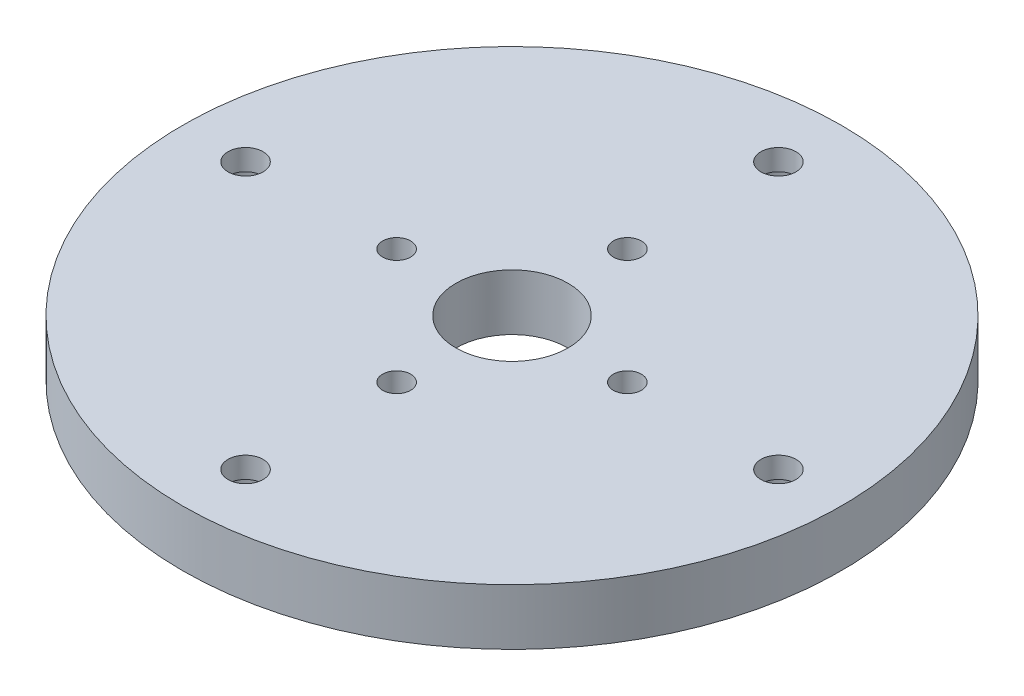
ISO-10303-21;
HEADER;
FILE_DESCRIPTION(('STEP AP214'),'2;1');
FILE_NAME('part.step','',(''),(''),'','','');
FILE_SCHEMA(('AUTOMOTIVE_DESIGN { 1 0 10303 214 1 1 1 1 }'));
ENDSEC;
DATA;
#1=APPLICATION_CONTEXT('core data for automotive mechanical design processes');
#2=APPLICATION_PROTOCOL_DEFINITION('international standard','automotive_design',2000,#1);
#3=PRODUCT_CONTEXT('',#1,'mechanical');
#4=PRODUCT('Part','Part','',(#3));
#5=PRODUCT_RELATED_PRODUCT_CATEGORY('part','',(#4));
#6=PRODUCT_DEFINITION_FORMATION('','',#4);
#7=PRODUCT_DEFINITION_CONTEXT('part definition',#1,'design');
#8=PRODUCT_DEFINITION('design','',#6,#7);
#9=PRODUCT_DEFINITION_SHAPE('','',#8);
#10=(LENGTH_UNIT() NAMED_UNIT(*) SI_UNIT(.MILLI.,.METRE.));
#11=(NAMED_UNIT(*) PLANE_ANGLE_UNIT() SI_UNIT($,.RADIAN.));
#12=(NAMED_UNIT(*) SI_UNIT($,.STERADIAN.) SOLID_ANGLE_UNIT());
#13=UNCERTAINTY_MEASURE_WITH_UNIT(LENGTH_MEASURE(1.E-05),#10,'distance_accuracy_value','');
#14=(GEOMETRIC_REPRESENTATION_CONTEXT(3) GLOBAL_UNCERTAINTY_ASSIGNED_CONTEXT((#13)) GLOBAL_UNIT_ASSIGNED_CONTEXT((#10,
#11,#12)) REPRESENTATION_CONTEXT('',''));
#15=CARTESIAN_POINT('',(0.,0.,0.));
#16=DIRECTION('',(0.,0.,1.));
#17=DIRECTION('',(1.,0.,0.));
#18=AXIS2_PLACEMENT_3D('',#15,#16,#17);
#19=CARTESIAN_POINT('',(-18.9999999999991,0.,7.01970902328204E-13));
#20=DIRECTION('',(0.,1.,0.));
#21=DIRECTION('',(0.,0.,1.));
#22=AXIS2_PLACEMENT_3D('',#19,#20,#21);
#23=CYLINDRICAL_SURFACE('',#22,1.25000000000112);
#24=CARTESIAN_POINT('',(-18.9999999999991,4.,7.01970902328204E-13));
#25=DIRECTION('',(0.,1.,0.));
#26=DIRECTION('',(0.,0.,1.));
#27=AXIS2_PLACEMENT_3D('',#24,#25,#26);
#28=CIRCLE('',#27,1.25000000000112);
#29=CARTESIAN_POINT('',(-18.9999999999991,4.,1.25000000000182));
#30=VERTEX_POINT('',#29);
#31=EDGE_CURVE('E97',#30,#30,#28,.T.);
#32=ORIENTED_EDGE('',*,*,#31,.T.);
#33=EDGE_LOOP('',(#32));
#34=FACE_BOUND('',#33,.T.);
#35=CARTESIAN_POINT('',(-18.9999999999991,2.5,7.01970902328204E-13));
#36=DIRECTION('',(0.,-1.,0.));
#37=DIRECTION('',(0.,0.,-1.));
#38=AXIS2_PLACEMENT_3D('',#35,#36,#37);
#39=CIRCLE('',#38,1.25000000000112);
#40=CARTESIAN_POINT('',(-18.9999999999991,2.5,-1.25000000000041));
#41=VERTEX_POINT('',#40);
#42=EDGE_CURVE('E47',#41,#41,#39,.F.);
#43=ORIENTED_EDGE('',*,*,#42,.F.);
#44=EDGE_LOOP('',(#43));
#45=FACE_BOUND('',#44,.T.);
#46=ADVANCED_FACE('F43',(#34,#45),#23,.F.);
#47=CARTESIAN_POINT('',(19.0000000000007,0.,-8.70831184940357E-13));
#48=DIRECTION('',(0.,1.,0.));
#49=DIRECTION('',(0.,0.,1.));
#50=AXIS2_PLACEMENT_3D('',#47,#48,#49);
#51=CYLINDRICAL_SURFACE('',#50,1.25000000000104);
#52=CARTESIAN_POINT('',(19.0000000000007,4.,-8.70831184940357E-13));
#53=DIRECTION('',(0.,1.,0.));
#54=DIRECTION('',(0.,0.,1.));
#55=AXIS2_PLACEMENT_3D('',#52,#53,#54);
#56=CIRCLE('',#55,1.25000000000104);
#57=CARTESIAN_POINT('',(19.0000000000007,4.,1.25000000000017));
#58=VERTEX_POINT('',#57);
#59=EDGE_CURVE('E107',#58,#58,#56,.T.);
#60=ORIENTED_EDGE('',*,*,#59,.T.);
#61=EDGE_LOOP('',(#60));
#62=FACE_BOUND('',#61,.T.);
#63=CARTESIAN_POINT('',(19.0000000000007,2.5,-8.70831184940357E-13));
#64=DIRECTION('',(0.,-1.,0.));
#65=DIRECTION('',(0.,0.,-1.));
#66=AXIS2_PLACEMENT_3D('',#63,#64,#65);
#67=CIRCLE('',#66,1.25000000000104);
#68=CARTESIAN_POINT('',(19.0000000000007,2.5,-1.25000000000191));
#69=VERTEX_POINT('',#68);
#70=EDGE_CURVE('E72',#69,#69,#67,.F.);
#71=ORIENTED_EDGE('',*,*,#70,.F.);
#72=EDGE_LOOP('',(#71));
#73=FACE_BOUND('',#72,.T.);
#74=ADVANCED_FACE('F167',(#62,#73),#51,.F.);
#75=CARTESIAN_POINT('',(1.57595694402207E-12,0.,18.9999999999998));
#76=DIRECTION('',(0.,1.,0.));
#77=DIRECTION('',(0.,0.,1.));
#78=AXIS2_PLACEMENT_3D('',#75,#76,#77);
#79=CYLINDRICAL_SURFACE('',#78,1.25000000000186);
#80=CARTESIAN_POINT('',(1.57595694402207E-12,4.,18.9999999999998));
#81=DIRECTION('',(0.,1.,0.));
#82=DIRECTION('',(0.,0.,1.));
#83=AXIS2_PLACEMENT_3D('',#80,#81,#82);
#84=CIRCLE('',#83,1.25000000000186);
#85=CARTESIAN_POINT('',(1.57595694402207E-12,4.,20.2500000000017));
#86=VERTEX_POINT('',#85);
#87=EDGE_CURVE('E90',#86,#86,#84,.T.);
#88=ORIENTED_EDGE('',*,*,#87,.T.);
#89=EDGE_LOOP('',(#88));
#90=FACE_BOUND('',#89,.T.);
#91=CARTESIAN_POINT('',(1.57595694402207E-12,2.5,18.9999999999998));
#92=DIRECTION('',(0.,-1.,0.));
#93=DIRECTION('',(0.,0.,-1.));
#94=AXIS2_PLACEMENT_3D('',#91,#92,#93);
#95=CIRCLE('',#94,1.25000000000186);
#96=CARTESIAN_POINT('',(1.57595694402207E-12,2.5,17.749999999998));
#97=VERTEX_POINT('',#96);
#98=EDGE_CURVE('E68',#97,#97,#95,.F.);
#99=ORIENTED_EDGE('',*,*,#98,.F.);
#100=EDGE_LOOP('',(#99));
#101=FACE_BOUND('',#100,.T.);
#102=ADVANCED_FACE('F173',(#90,#101),#79,.F.);
#103=CARTESIAN_POINT('',(0.,0.,-19.));
#104=DIRECTION('',(0.,1.,0.));
#105=DIRECTION('',(0.,0.,1.));
#106=AXIS2_PLACEMENT_3D('',#103,#104,#105);
#107=CYLINDRICAL_SURFACE('',#106,1.25);
#108=CARTESIAN_POINT('',(0.,4.,-19.));
#109=DIRECTION('',(0.,1.,0.));
#110=DIRECTION('',(0.,0.,1.));
#111=AXIS2_PLACEMENT_3D('',#108,#109,#110);
#112=CIRCLE('',#111,1.25);
#113=CARTESIAN_POINT('',(0.,4.,-17.75));
#114=VERTEX_POINT('',#113);
#115=EDGE_CURVE('E58',#114,#114,#112,.T.);
#116=ORIENTED_EDGE('',*,*,#115,.T.);
#117=EDGE_LOOP('',(#116));
#118=FACE_BOUND('',#117,.T.);
#119=CARTESIAN_POINT('',(0.,2.5,-19.));
#120=DIRECTION('',(0.,-1.,0.));
#121=DIRECTION('',(0.,0.,-1.));
#122=AXIS2_PLACEMENT_3D('',#119,#120,#121);
#123=CIRCLE('',#122,1.25);
#124=CARTESIAN_POINT('',(0.,2.5,-20.25));
#125=VERTEX_POINT('',#124);
#126=EDGE_CURVE('E64',#125,#125,#123,.F.);
#127=ORIENTED_EDGE('',*,*,#126,.F.);
#128=EDGE_LOOP('',(#127));
#129=FACE_BOUND('',#128,.T.);
#130=ADVANCED_FACE('F195',(#118,#129),#107,.F.);
#131=CARTESIAN_POINT('',(0.,4.,0.));
#132=DIRECTION('',(0.,-1.,0.));
#133=DIRECTION('',(0.,0.,-1.));
#134=AXIS2_PLACEMENT_3D('',#131,#132,#133);
#135=CYLINDRICAL_SURFACE('',#134,23.5);
#136=CARTESIAN_POINT('',(0.,4.,0.));
#137=DIRECTION('',(0.,1.,0.));
#138=DIRECTION('',(0.,0.,1.));
#139=AXIS2_PLACEMENT_3D('',#136,#137,#138);
#140=CIRCLE('',#139,23.5);
#141=CARTESIAN_POINT('',(0.,4.,23.5));
#142=VERTEX_POINT('',#141);
#143=EDGE_CURVE('E10',#142,#142,#140,.T.);
#144=ORIENTED_EDGE('',*,*,#143,.F.);
#145=EDGE_LOOP('',(#144));
#146=FACE_BOUND('',#145,.T.);
#147=CARTESIAN_POINT('',(0.,0.,0.));
#148=DIRECTION('',(0.,1.,0.));
#149=DIRECTION('',(0.,0.,1.));
#150=AXIS2_PLACEMENT_3D('',#147,#148,#149);
#151=CIRCLE('',#150,23.5);
#152=CARTESIAN_POINT('',(0.,0.,23.5));
#153=VERTEX_POINT('',#152);
#154=EDGE_CURVE('E52',#153,#153,#151,.T.);
#155=ORIENTED_EDGE('',*,*,#154,.T.);
#156=EDGE_LOOP('',(#155));
#157=FACE_BOUND('',#156,.T.);
#158=ADVANCED_FACE('F45',(#146,#157),#135,.T.);
#159=CARTESIAN_POINT('',(0.,4.,0.));
#160=DIRECTION('',(0.,1.,0.));
#161=DIRECTION('',(0.,0.,1.));
#162=AXIS2_PLACEMENT_3D('',#159,#160,#161);
#163=PLANE('',#162);
#164=CARTESIAN_POINT('',(0.,4.,0.));
#165=DIRECTION('',(0.,1.,0.));
#166=DIRECTION('',(0.,0.,1.));
#167=AXIS2_PLACEMENT_3D('',#164,#165,#166);
#168=CIRCLE('',#167,4.);
#169=CARTESIAN_POINT('',(0.,4.,4.));
#170=VERTEX_POINT('',#169);
#171=EDGE_CURVE('E79',#170,#170,#168,.F.);
#172=ORIENTED_EDGE('',*,*,#171,.T.);
#173=EDGE_LOOP('',(#172));
#174=FACE_BOUND('',#173,.T.);
#175=ORIENTED_EDGE('',*,*,#115,.F.);
#176=EDGE_LOOP('',(#175));
#177=FACE_BOUND('',#176,.T.);
#178=ORIENTED_EDGE('',*,*,#87,.F.);
#179=EDGE_LOOP('',(#178));
#180=FACE_BOUND('',#179,.T.);
#181=ORIENTED_EDGE('',*,*,#59,.F.);
#182=EDGE_LOOP('',(#181));
#183=FACE_BOUND('',#182,.T.);
#184=CARTESIAN_POINT('',(-8.22706251705486,4.,2.33323418036613E-13));
#185=DIRECTION('',(0.,1.,0.));
#186=DIRECTION('',(0.,0.,1.));
#187=AXIS2_PLACEMENT_3D('',#184,#185,#186);
#188=CIRCLE('',#187,1.00000000000037);
#189=CARTESIAN_POINT('',(-8.22706251705486,4.,1.00000000000061));
#190=VERTEX_POINT('',#189);
#191=EDGE_CURVE('E103',#190,#190,#188,.T.);
#192=ORIENTED_EDGE('',*,*,#191,.F.);
#193=EDGE_LOOP('',(#192));
#194=FACE_BOUND('',#193,.T.);
#195=ORIENTED_EDGE('',*,*,#31,.F.);
#196=EDGE_LOOP('',(#195));
#197=FACE_BOUND('',#196,.T.);
#198=CARTESIAN_POINT('',(0.,4.,-8.2270625170551));
#199=DIRECTION('',(0.,1.,0.));
#200=DIRECTION('',(0.,0.,1.));
#201=AXIS2_PLACEMENT_3D('',#198,#199,#200);
#202=CIRCLE('',#201,1.);
#203=CARTESIAN_POINT('',(0.,4.,-7.2270625170551));
#204=VERTEX_POINT('',#203);
#205=EDGE_CURVE('E61',#204,#204,#202,.T.);
#206=ORIENTED_EDGE('',*,*,#205,.F.);
#207=EDGE_LOOP('',(#206));
#208=FACE_BOUND('',#207,.T.);
#209=CARTESIAN_POINT('',(8.22706251705533,4.,-2.32315893458824E-13));
#210=DIRECTION('',(0.,1.,0.));
#211=DIRECTION('',(0.,0.,1.));
#212=AXIS2_PLACEMENT_3D('',#209,#210,#211);
#213=CIRCLE('',#212,1.00000000000018);
#214=CARTESIAN_POINT('',(8.22706251705533,4.,0.99999999999995));
#215=VERTEX_POINT('',#214);
#216=EDGE_CURVE('E118',#215,#215,#213,.T.);
#217=ORIENTED_EDGE('',*,*,#216,.F.);
#218=EDGE_LOOP('',(#217));
#219=FACE_BOUND('',#218,.T.);
#220=CARTESIAN_POINT('',(4.64631786917647E-13,4.,8.2270625170551));
#221=DIRECTION('',(0.,1.,0.));
#222=DIRECTION('',(0.,0.,1.));
#223=AXIS2_PLACEMENT_3D('',#220,#221,#222);
#224=CIRCLE('',#223,1.0000000000005);
#225=CARTESIAN_POINT('',(4.64631786917647E-13,4.,9.22706251705559));
#226=VERTEX_POINT('',#225);
#227=EDGE_CURVE('E102',#226,#226,#224,.T.);
#228=ORIENTED_EDGE('',*,*,#227,.F.);
#229=EDGE_LOOP('',(#228));
#230=FACE_BOUND('',#229,.T.);
#231=ORIENTED_EDGE('',*,*,#143,.T.);
#232=EDGE_LOOP('',(#231));
#233=FACE_BOUND('',#232,.T.);
#234=ADVANCED_FACE('F142',(#174,#177,#180,#183,#194,#197,#208,#219,#230,#233),#163,.T.);
#235=CARTESIAN_POINT('',(0.,0.,0.));
#236=DIRECTION('',(0.,1.,0.));
#237=DIRECTION('',(0.,0.,1.));
#238=AXIS2_PLACEMENT_3D('',#235,#236,#237);
#239=PLANE('',#238);
#240=CARTESIAN_POINT('',(1.57165946923499E-12,0.,18.9999999999998));
#241=DIRECTION('',(0.,-1.,0.));
#242=DIRECTION('',(0.,0.,-1.));
#243=AXIS2_PLACEMENT_3D('',#240,#241,#242);
#244=CIRCLE('',#243,2.5);
#245=CARTESIAN_POINT('',(1.57165946923499E-12,0.,16.4999999999998));
#246=VERTEX_POINT('',#245);
#247=EDGE_CURVE('E271',#246,#246,#244,.T.);
#248=ORIENTED_EDGE('',*,*,#247,.F.);
#249=EDGE_LOOP('',(#248));
#250=FACE_BOUND('',#249,.T.);
#251=CARTESIAN_POINT('',(-18.9999999999991,0.,6.99093560818653E-13));
#252=DIRECTION('',(0.,-1.,0.));
#253=DIRECTION('',(0.,0.,-1.));
#254=AXIS2_PLACEMENT_3D('',#251,#252,#253);
#255=CIRCLE('',#254,2.5);
#256=CARTESIAN_POINT('',(-18.9999999999991,0.,-2.4999999999993));
#257=VERTEX_POINT('',#256);
#258=EDGE_CURVE('E263',#257,#257,#255,.T.);
#259=ORIENTED_EDGE('',*,*,#258,.F.);
#260=EDGE_LOOP('',(#259));
#261=FACE_BOUND('',#260,.T.);
#262=CARTESIAN_POINT('',(19.0000000000007,0.,-8.6909646146438E-13));
#263=DIRECTION('',(0.,-1.,0.));
#264=DIRECTION('',(0.,0.,-1.));
#265=AXIS2_PLACEMENT_3D('',#262,#263,#264);
#266=CIRCLE('',#265,2.5);
#267=CARTESIAN_POINT('',(19.0000000000007,0.,-2.50000000000087));
#268=VERTEX_POINT('',#267);
#269=EDGE_CURVE('E250',#268,#268,#266,.T.);
#270=ORIENTED_EDGE('',*,*,#269,.F.);
#271=EDGE_LOOP('',(#270));
#272=FACE_BOUND('',#271,.T.);
#273=CARTESIAN_POINT('',(0.,0.,-19.));
#274=DIRECTION('',(0.,-1.,0.));
#275=DIRECTION('',(0.,0.,-1.));
#276=AXIS2_PLACEMENT_3D('',#273,#274,#275);
#277=CIRCLE('',#276,2.5);
#278=CARTESIAN_POINT('',(0.,0.,-21.5));
#279=VERTEX_POINT('',#278);
#280=EDGE_CURVE('E251',#279,#279,#277,.T.);
#281=ORIENTED_EDGE('',*,*,#280,.F.);
#282=EDGE_LOOP('',(#281));
#283=FACE_BOUND('',#282,.T.);
#284=CARTESIAN_POINT('',(0.,0.,0.));
#285=DIRECTION('',(0.,-1.,0.));
#286=DIRECTION('',(0.,0.,-1.));
#287=AXIS2_PLACEMENT_3D('',#284,#285,#286);
#288=CIRCLE('',#287,4.);
#289=CARTESIAN_POINT('',(0.,0.,-4.));
#290=VERTEX_POINT('',#289);
#291=EDGE_CURVE('E84',#290,#290,#288,.T.);
#292=ORIENTED_EDGE('',*,*,#291,.F.);
#293=EDGE_LOOP('',(#292));
#294=FACE_BOUND('',#293,.T.);
#295=CARTESIAN_POINT('',(-8.22706251705486,0.,2.33323418036613E-13));
#296=DIRECTION('',(0.,1.,0.));
#297=DIRECTION('',(0.,0.,1.));
#298=AXIS2_PLACEMENT_3D('',#295,#296,#297);
#299=CIRCLE('',#298,1.00000000000037);
#300=CARTESIAN_POINT('',(-8.22706251705486,0.,1.00000000000061));
#301=VERTEX_POINT('',#300);
#302=EDGE_CURVE('E98',#301,#301,#299,.T.);
#303=ORIENTED_EDGE('',*,*,#302,.T.);
#304=EDGE_LOOP('',(#303));
#305=FACE_BOUND('',#304,.T.);
#306=CARTESIAN_POINT('',(0.,0.,-8.2270625170551));
#307=DIRECTION('',(0.,1.,0.));
#308=DIRECTION('',(0.,0.,1.));
#309=AXIS2_PLACEMENT_3D('',#306,#307,#308);
#310=CIRCLE('',#309,1.);
#311=CARTESIAN_POINT('',(0.,0.,-7.2270625170551));
#312=VERTEX_POINT('',#311);
#313=EDGE_CURVE('E131',#312,#312,#310,.T.);
#314=ORIENTED_EDGE('',*,*,#313,.T.);
#315=EDGE_LOOP('',(#314));
#316=FACE_BOUND('',#315,.T.);
#317=CARTESIAN_POINT('',(8.22706251705533,0.,-2.32315893458824E-13));
#318=DIRECTION('',(0.,1.,0.));
#319=DIRECTION('',(0.,0.,1.));
#320=AXIS2_PLACEMENT_3D('',#317,#318,#319);
#321=CIRCLE('',#320,1.00000000000018);
#322=CARTESIAN_POINT('',(8.22706251705533,0.,0.99999999999995));
#323=VERTEX_POINT('',#322);
#324=EDGE_CURVE('E114',#323,#323,#321,.T.);
#325=ORIENTED_EDGE('',*,*,#324,.T.);
#326=EDGE_LOOP('',(#325));
#327=FACE_BOUND('',#326,.T.);
#328=CARTESIAN_POINT('',(4.64631786917647E-13,0.,8.2270625170551));
#329=DIRECTION('',(0.,1.,0.));
#330=DIRECTION('',(0.,0.,1.));
#331=AXIS2_PLACEMENT_3D('',#328,#329,#330);
#332=CIRCLE('',#331,1.0000000000005);
#333=CARTESIAN_POINT('',(4.64631786917647E-13,0.,9.22706251705559));
#334=VERTEX_POINT('',#333);
#335=EDGE_CURVE('E122',#334,#334,#332,.T.);
#336=ORIENTED_EDGE('',*,*,#335,.T.);
#337=EDGE_LOOP('',(#336));
#338=FACE_BOUND('',#337,.T.);
#339=ORIENTED_EDGE('',*,*,#154,.F.);
#340=EDGE_LOOP('',(#339));
#341=FACE_BOUND('',#340,.T.);
#342=ADVANCED_FACE('F145',(#250,#261,#272,#283,#294,#305,#316,#327,#338,#341),#239,.F.);
#343=CARTESIAN_POINT('',(4.64631786917647E-13,0.,8.2270625170551));
#344=DIRECTION('',(0.,1.,0.));
#345=DIRECTION('',(0.,0.,1.));
#346=AXIS2_PLACEMENT_3D('',#343,#344,#345);
#347=CYLINDRICAL_SURFACE('',#346,1.0000000000005);
#348=ORIENTED_EDGE('',*,*,#335,.F.);
#349=EDGE_LOOP('',(#348));
#350=FACE_BOUND('',#349,.T.);
#351=ORIENTED_EDGE('',*,*,#227,.T.);
#352=EDGE_LOOP('',(#351));
#353=FACE_BOUND('',#352,.T.);
#354=ADVANCED_FACE('F151',(#350,#353),#347,.F.);
#355=CARTESIAN_POINT('',(8.22706251705533,0.,-2.32315893458824E-13));
#356=DIRECTION('',(0.,1.,0.));
#357=DIRECTION('',(0.,0.,1.));
#358=AXIS2_PLACEMENT_3D('',#355,#356,#357);
#359=CYLINDRICAL_SURFACE('',#358,1.00000000000018);
#360=ORIENTED_EDGE('',*,*,#324,.F.);
#361=EDGE_LOOP('',(#360));
#362=FACE_BOUND('',#361,.T.);
#363=ORIENTED_EDGE('',*,*,#216,.T.);
#364=EDGE_LOOP('',(#363));
#365=FACE_BOUND('',#364,.T.);
#366=ADVANCED_FACE('F153',(#362,#365),#359,.F.);
#367=CARTESIAN_POINT('',(0.,0.,-8.2270625170551));
#368=DIRECTION('',(0.,1.,0.));
#369=DIRECTION('',(0.,0.,1.));
#370=AXIS2_PLACEMENT_3D('',#367,#368,#369);
#371=CYLINDRICAL_SURFACE('',#370,1.);
#372=ORIENTED_EDGE('',*,*,#313,.F.);
#373=EDGE_LOOP('',(#372));
#374=FACE_BOUND('',#373,.T.);
#375=ORIENTED_EDGE('',*,*,#205,.T.);
#376=EDGE_LOOP('',(#375));
#377=FACE_BOUND('',#376,.T.);
#378=ADVANCED_FACE('F140',(#374,#377),#371,.F.);
#379=CARTESIAN_POINT('',(-8.22706251705486,0.,2.33323418036613E-13));
#380=DIRECTION('',(0.,1.,0.));
#381=DIRECTION('',(0.,0.,1.));
#382=AXIS2_PLACEMENT_3D('',#379,#380,#381);
#383=CYLINDRICAL_SURFACE('',#382,1.00000000000037);
#384=ORIENTED_EDGE('',*,*,#302,.F.);
#385=EDGE_LOOP('',(#384));
#386=FACE_BOUND('',#385,.T.);
#387=ORIENTED_EDGE('',*,*,#191,.T.);
#388=EDGE_LOOP('',(#387));
#389=FACE_BOUND('',#388,.T.);
#390=ADVANCED_FACE('F179',(#386,#389),#383,.F.);
#391=CARTESIAN_POINT('',(0.,4.001,0.));
#392=DIRECTION('',(0.,-1.,0.));
#393=DIRECTION('',(0.,0.,-1.));
#394=AXIS2_PLACEMENT_3D('',#391,#392,#393);
#395=CYLINDRICAL_SURFACE('',#394,4.);
#396=ORIENTED_EDGE('',*,*,#171,.F.);
#397=EDGE_LOOP('',(#396));
#398=FACE_BOUND('',#397,.T.);
#399=ORIENTED_EDGE('',*,*,#291,.T.);
#400=EDGE_LOOP('',(#399));
#401=FACE_BOUND('',#400,.T.);
#402=ADVANCED_FACE('F184',(#398,#401),#395,.F.);
#403=CARTESIAN_POINT('',(0.,2.5,-19.));
#404=DIRECTION('',(0.,-1.,0.));
#405=DIRECTION('',(0.,0.,-1.));
#406=AXIS2_PLACEMENT_3D('',#403,#404,#405);
#407=PLANE('',#406);
#408=CARTESIAN_POINT('',(0.,2.5,-19.));
#409=DIRECTION('',(0.,-1.,0.));
#410=DIRECTION('',(0.,0.,-1.));
#411=AXIS2_PLACEMENT_3D('',#408,#409,#410);
#412=CIRCLE('',#411,2.5);
#413=CARTESIAN_POINT('',(0.,2.5,-21.5));
#414=VERTEX_POINT('',#413);
#415=EDGE_CURVE('E246',#414,#414,#412,.T.);
#416=ORIENTED_EDGE('',*,*,#415,.T.);
#417=EDGE_LOOP('',(#416));
#418=FACE_BOUND('',#417,.T.);
#419=ORIENTED_EDGE('',*,*,#126,.T.);
#420=EDGE_LOOP('',(#419));
#421=FACE_BOUND('',#420,.T.);
#422=ADVANCED_FACE('F189',(#418,#421),#407,.T.);
#423=CARTESIAN_POINT('',(0.,2.5,-19.));
#424=DIRECTION('',(0.,-1.,0.));
#425=DIRECTION('',(0.,0.,-1.));
#426=AXIS2_PLACEMENT_3D('',#423,#424,#425);
#427=CYLINDRICAL_SURFACE('',#426,2.5);
#428=ORIENTED_EDGE('',*,*,#415,.F.);
#429=EDGE_LOOP('',(#428));
#430=FACE_BOUND('',#429,.T.);
#431=ORIENTED_EDGE('',*,*,#280,.T.);
#432=EDGE_LOOP('',(#431));
#433=FACE_BOUND('',#432,.T.);
#434=ADVANCED_FACE('F210',(#430,#433),#427,.F.);
#435=CARTESIAN_POINT('',(1.57165946923499E-12,2.5,18.9999999999998));
#436=DIRECTION('',(0.,-1.,0.));
#437=DIRECTION('',(0.,0.,-1.));
#438=AXIS2_PLACEMENT_3D('',#435,#436,#437);
#439=PLANE('',#438);
#440=CARTESIAN_POINT('',(1.57165946923499E-12,2.5,18.9999999999998));
#441=DIRECTION('',(0.,-1.,0.));
#442=DIRECTION('',(0.,0.,-1.));
#443=AXIS2_PLACEMENT_3D('',#440,#441,#442);
#444=CIRCLE('',#443,2.5);
#445=CARTESIAN_POINT('',(1.57165946923499E-12,2.5,16.4999999999998));
#446=VERTEX_POINT('',#445);
#447=EDGE_CURVE('E69',#446,#446,#444,.T.);
#448=ORIENTED_EDGE('',*,*,#447,.T.);
#449=EDGE_LOOP('',(#448));
#450=FACE_BOUND('',#449,.T.);
#451=ORIENTED_EDGE('',*,*,#98,.T.);
#452=EDGE_LOOP('',(#451));
#453=FACE_BOUND('',#452,.T.);
#454=ADVANCED_FACE('F207',(#450,#453),#439,.T.);
#455=CARTESIAN_POINT('',(1.57165946923499E-12,2.5,18.9999999999998));
#456=DIRECTION('',(0.,-1.,0.));
#457=DIRECTION('',(0.,0.,-1.));
#458=AXIS2_PLACEMENT_3D('',#455,#456,#457);
#459=CYLINDRICAL_SURFACE('',#458,2.5);
#460=ORIENTED_EDGE('',*,*,#447,.F.);
#461=EDGE_LOOP('',(#460));
#462=FACE_BOUND('',#461,.T.);
#463=ORIENTED_EDGE('',*,*,#247,.T.);
#464=EDGE_LOOP('',(#463));
#465=FACE_BOUND('',#464,.T.);
#466=ADVANCED_FACE('F209',(#462,#465),#459,.F.);
#467=CARTESIAN_POINT('',(19.0000000000007,2.5,-8.6909646146438E-13));
#468=DIRECTION('',(0.,-1.,0.));
#469=DIRECTION('',(0.,0.,-1.));
#470=AXIS2_PLACEMENT_3D('',#467,#468,#469);
#471=PLANE('',#470);
#472=CARTESIAN_POINT('',(19.0000000000007,2.5,-8.6909646146438E-13));
#473=DIRECTION('',(0.,-1.,0.));
#474=DIRECTION('',(0.,0.,-1.));
#475=AXIS2_PLACEMENT_3D('',#472,#473,#474);
#476=CIRCLE('',#475,2.5);
#477=CARTESIAN_POINT('',(19.0000000000007,2.5,-2.50000000000087));
#478=VERTEX_POINT('',#477);
#479=EDGE_CURVE('E256',#478,#478,#476,.T.);
#480=ORIENTED_EDGE('',*,*,#479,.T.);
#481=EDGE_LOOP('',(#480));
#482=FACE_BOUND('',#481,.T.);
#483=ORIENTED_EDGE('',*,*,#70,.T.);
#484=EDGE_LOOP('',(#483));
#485=FACE_BOUND('',#484,.T.);
#486=ADVANCED_FACE('F217',(#482,#485),#471,.T.);
#487=CARTESIAN_POINT('',(19.0000000000007,2.5,-8.6909646146438E-13));
#488=DIRECTION('',(0.,-1.,0.));
#489=DIRECTION('',(0.,0.,-1.));
#490=AXIS2_PLACEMENT_3D('',#487,#488,#489);
#491=CYLINDRICAL_SURFACE('',#490,2.5);
#492=ORIENTED_EDGE('',*,*,#479,.F.);
#493=EDGE_LOOP('',(#492));
#494=FACE_BOUND('',#493,.T.);
#495=ORIENTED_EDGE('',*,*,#269,.T.);
#496=EDGE_LOOP('',(#495));
#497=FACE_BOUND('',#496,.T.);
#498=ADVANCED_FACE('F228',(#494,#497),#491,.F.);
#499=CARTESIAN_POINT('',(-18.9999999999991,2.5,6.99093560818653E-13));
#500=DIRECTION('',(0.,-1.,0.));
#501=DIRECTION('',(0.,0.,-1.));
#502=AXIS2_PLACEMENT_3D('',#499,#500,#501);
#503=PLANE('',#502);
#504=CARTESIAN_POINT('',(-18.9999999999991,2.5,6.99093560818653E-13));
#505=DIRECTION('',(0.,-1.,0.));
#506=DIRECTION('',(0.,0.,-1.));
#507=AXIS2_PLACEMENT_3D('',#504,#505,#506);
#508=CIRCLE('',#507,2.5);
#509=CARTESIAN_POINT('',(-18.9999999999991,2.5,-2.4999999999993));
#510=VERTEX_POINT('',#509);
#511=EDGE_CURVE('E267',#510,#510,#508,.T.);
#512=ORIENTED_EDGE('',*,*,#511,.T.);
#513=EDGE_LOOP('',(#512));
#514=FACE_BOUND('',#513,.T.);
#515=ORIENTED_EDGE('',*,*,#42,.T.);
#516=EDGE_LOOP('',(#515));
#517=FACE_BOUND('',#516,.T.);
#518=ADVANCED_FACE('F224',(#514,#517),#503,.T.);
#519=CARTESIAN_POINT('',(-18.9999999999991,2.5,6.99093560818653E-13));
#520=DIRECTION('',(0.,-1.,0.));
#521=DIRECTION('',(0.,0.,-1.));
#522=AXIS2_PLACEMENT_3D('',#519,#520,#521);
#523=CYLINDRICAL_SURFACE('',#522,2.5);
#524=ORIENTED_EDGE('',*,*,#511,.F.);
#525=EDGE_LOOP('',(#524));
#526=FACE_BOUND('',#525,.T.);
#527=ORIENTED_EDGE('',*,*,#258,.T.);
#528=EDGE_LOOP('',(#527));
#529=FACE_BOUND('',#528,.T.);
#530=ADVANCED_FACE('F227',(#526,#529),#523,.F.);
#531=CLOSED_SHELL('',(#46,#74,#102,#130,#158,#234,#342,#354,#366,#378,#390,#402,#422,#434,#454,
#466,#486,#498,#518,#530));
#532=MANIFOLD_SOLID_BREP('B2',#531);
#533=ADVANCED_BREP_SHAPE_REPRESENTATION('',(#18,#532),#14);
#534=SHAPE_DEFINITION_REPRESENTATION(#9,#533);
ENDSEC;
END-ISO-10303-21;
